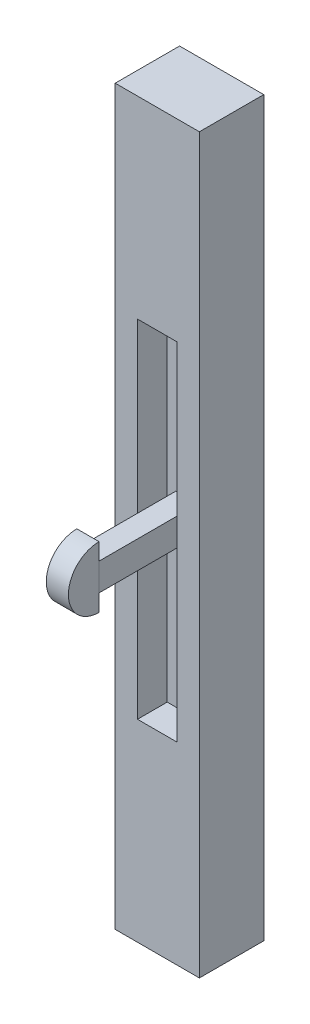
ISO-10303-21;
HEADER;
FILE_DESCRIPTION(('STEP AP214'),'2;1');
FILE_NAME('part.step','',(''),(''),'','','');
FILE_SCHEMA(('AUTOMOTIVE_DESIGN { 1 0 10303 214 1 1 1 1 }'));
ENDSEC;
DATA;
#1=APPLICATION_CONTEXT('core data for automotive mechanical design processes');
#2=APPLICATION_PROTOCOL_DEFINITION('international standard','automotive_design',2000,#1);
#3=PRODUCT_CONTEXT('',#1,'mechanical');
#4=PRODUCT('Part','Part','',(#3));
#5=PRODUCT_RELATED_PRODUCT_CATEGORY('part','',(#4));
#6=PRODUCT_DEFINITION_FORMATION('','',#4);
#7=PRODUCT_DEFINITION_CONTEXT('part definition',#1,'design');
#8=PRODUCT_DEFINITION('design','',#6,#7);
#9=PRODUCT_DEFINITION_SHAPE('','',#8);
#10=(LENGTH_UNIT() NAMED_UNIT(*) SI_UNIT(.MILLI.,.METRE.));
#11=(NAMED_UNIT(*) PLANE_ANGLE_UNIT() SI_UNIT($,.RADIAN.));
#12=(NAMED_UNIT(*) SI_UNIT($,.STERADIAN.) SOLID_ANGLE_UNIT());
#13=UNCERTAINTY_MEASURE_WITH_UNIT(LENGTH_MEASURE(1.E-05),#10,'distance_accuracy_value','');
#14=(GEOMETRIC_REPRESENTATION_CONTEXT(3) GLOBAL_UNCERTAINTY_ASSIGNED_CONTEXT((#13)) GLOBAL_UNIT_ASSIGNED_CONTEXT((#10,
#11,#12)) REPRESENTATION_CONTEXT('',''));
#15=CARTESIAN_POINT('',(0.,0.,0.));
#16=DIRECTION('',(0.,0.,1.));
#17=DIRECTION('',(1.,0.,0.));
#18=AXIS2_PLACEMENT_3D('',#15,#16,#17);
#19=CARTESIAN_POINT('',(0.,0.,3.5));
#20=DIRECTION('',(0.,0.,-1.));
#21=DIRECTION('',(-1.,0.,0.));
#22=AXIS2_PLACEMENT_3D('',#19,#20,#21);
#23=PLANE('',#22);
#24=DIRECTION('',(0.,1.,0.));
#25=VECTOR('',#24,1.);
#26=CARTESIAN_POINT('',(2.,-17.5,3.5));
#27=LINE('',#26,#25);
#28=CARTESIAN_POINT('',(2.,-17.5,3.5));
#29=VERTEX_POINT('',#28);
#30=CARTESIAN_POINT('',(2.,17.5,3.5));
#31=VERTEX_POINT('',#30);
#32=EDGE_CURVE('E394',#29,#31,#27,.T.);
#33=ORIENTED_EDGE('',*,*,#32,.T.);
#34=DIRECTION('',(-1.,0.,0.));
#35=VECTOR('',#34,1.);
#36=CARTESIAN_POINT('',(-2.,17.5,3.5));
#37=LINE('',#36,#35);
#38=CARTESIAN_POINT('',(-2.,17.5,3.5));
#39=VERTEX_POINT('',#38);
#40=EDGE_CURVE('E382',#31,#39,#37,.T.);
#41=ORIENTED_EDGE('',*,*,#40,.T.);
#42=DIRECTION('',(0.,-1.,0.));
#43=VECTOR('',#42,1.);
#44=CARTESIAN_POINT('',(-2.,-17.5,3.5));
#45=LINE('',#44,#43);
#46=CARTESIAN_POINT('',(-2.,-17.5,3.5));
#47=VERTEX_POINT('',#46);
#48=EDGE_CURVE('E378',#39,#47,#45,.T.);
#49=ORIENTED_EDGE('',*,*,#48,.T.);
#50=DIRECTION('',(1.,0.,0.));
#51=VECTOR('',#50,1.);
#52=CARTESIAN_POINT('',(-2.,-17.5,3.5));
#53=LINE('',#52,#51);
#54=EDGE_CURVE('E373',#47,#29,#53,.T.);
#55=ORIENTED_EDGE('',*,*,#54,.T.);
#56=EDGE_LOOP('',(#33,#41,#49,#55));
#57=FACE_BOUND('',#56,.T.);
#58=DIRECTION('',(0.,1.,0.));
#59=VECTOR('',#58,1.);
#60=CARTESIAN_POINT('',(1.12138831059993,-1.39122497803587,3.5));
#61=LINE('',#60,#59);
#62=CARTESIAN_POINT('',(1.12138831059993,-1.39122497803587,3.5));
#63=VERTEX_POINT('',#62);
#64=CARTESIAN_POINT('',(1.12138831059993,1.39122497803587,3.5));
#65=VERTEX_POINT('',#64);
#66=EDGE_CURVE('E158',#63,#65,#61,.T.);
#67=ORIENTED_EDGE('',*,*,#66,.F.);
#68=DIRECTION('',(1.,0.,0.));
#69=VECTOR('',#68,1.);
#70=CARTESIAN_POINT('',(-1.12138831059993,-1.39122497803587,3.5));
#71=LINE('',#70,#69);
#72=CARTESIAN_POINT('',(-1.12138831059993,-1.39122497803587,3.5));
#73=VERTEX_POINT('',#72);
#74=EDGE_CURVE('E152',#73,#63,#71,.T.);
#75=ORIENTED_EDGE('',*,*,#74,.F.);
#76=DIRECTION('',(0.,-1.,0.));
#77=VECTOR('',#76,1.);
#78=CARTESIAN_POINT('',(-1.12138831059993,-1.39122497803587,3.5));
#79=LINE('',#78,#77);
#80=CARTESIAN_POINT('',(-1.12138831059993,1.39122497803587,3.5));
#81=VERTEX_POINT('',#80);
#82=EDGE_CURVE('E156',#81,#73,#79,.T.);
#83=ORIENTED_EDGE('',*,*,#82,.F.);
#84=DIRECTION('',(-1.,0.,0.));
#85=VECTOR('',#84,1.);
#86=CARTESIAN_POINT('',(-1.12138831059993,1.39122497803587,3.5));
#87=LINE('',#86,#85);
#88=EDGE_CURVE('E58',#65,#81,#87,.T.);
#89=ORIENTED_EDGE('',*,*,#88,.F.);
#90=EDGE_LOOP('',(#67,#75,#83,#89));
#91=FACE_BOUND('',#90,.T.);
#92=ADVANCED_FACE('F41',(#57,#91),#23,.F.);
#93=CARTESIAN_POINT('',(4.25,37.,6.5));
#94=DIRECTION('',(0.,-1.,0.));
#95=DIRECTION('',(0.,0.,-1.));
#96=AXIS2_PLACEMENT_3D('',#93,#94,#95);
#97=PLANE('',#96);
#98=DIRECTION('',(-1.,0.,0.));
#99=VECTOR('',#98,1.);
#100=CARTESIAN_POINT('',(4.25,37.,0.));
#101=LINE('',#100,#99);
#102=CARTESIAN_POINT('',(4.25,37.,0.));
#103=VERTEX_POINT('',#102);
#104=CARTESIAN_POINT('',(-4.25,37.,0.));
#105=VERTEX_POINT('',#104);
#106=EDGE_CURVE('E332',#103,#105,#101,.T.);
#107=ORIENTED_EDGE('',*,*,#106,.T.);
#108=DIRECTION('',(0.,0.,-1.));
#109=VECTOR('',#108,1.);
#110=CARTESIAN_POINT('',(-4.25,37.,6.5));
#111=LINE('',#110,#109);
#112=CARTESIAN_POINT('',(-4.25,37.,6.5));
#113=VERTEX_POINT('',#112);
#114=EDGE_CURVE('E11',#113,#105,#111,.T.);
#115=ORIENTED_EDGE('',*,*,#114,.F.);
#116=DIRECTION('',(-1.,0.,0.));
#117=VECTOR('',#116,1.);
#118=CARTESIAN_POINT('',(4.25,37.,6.5));
#119=LINE('',#118,#117);
#120=CARTESIAN_POINT('',(4.25,37.,6.5));
#121=VERTEX_POINT('',#120);
#122=EDGE_CURVE('E343',#121,#113,#119,.T.);
#123=ORIENTED_EDGE('',*,*,#122,.F.);
#124=DIRECTION('',(0.,0.,-1.));
#125=VECTOR('',#124,1.);
#126=CARTESIAN_POINT('',(4.25,37.,6.5));
#127=LINE('',#126,#125);
#128=EDGE_CURVE('E342',#121,#103,#127,.T.);
#129=ORIENTED_EDGE('',*,*,#128,.T.);
#130=EDGE_LOOP('',(#107,#115,#123,#129));
#131=FACE_BOUND('',#130,.T.);
#132=ADVANCED_FACE('F43',(#131),#97,.F.);
#133=CARTESIAN_POINT('',(-4.25,-37.,6.5));
#134=DIRECTION('',(1.,0.,0.));
#135=DIRECTION('',(0.,0.,-1.));
#136=AXIS2_PLACEMENT_3D('',#133,#134,#135);
#137=PLANE('',#136);
#138=DIRECTION('',(0.,-1.,0.));
#139=VECTOR('',#138,1.);
#140=CARTESIAN_POINT('',(-4.25,-37.,0.));
#141=LINE('',#140,#139);
#142=CARTESIAN_POINT('',(-4.25,-37.,0.));
#143=VERTEX_POINT('',#142);
#144=EDGE_CURVE('E323',#105,#143,#141,.T.);
#145=ORIENTED_EDGE('',*,*,#144,.T.);
#146=DIRECTION('',(0.,0.,-1.));
#147=VECTOR('',#146,1.);
#148=CARTESIAN_POINT('',(-4.25,-37.,6.5));
#149=LINE('',#148,#147);
#150=CARTESIAN_POINT('',(-4.25,-37.,6.5));
#151=VERTEX_POINT('',#150);
#152=EDGE_CURVE('E51',#151,#143,#149,.T.);
#153=ORIENTED_EDGE('',*,*,#152,.F.);
#154=DIRECTION('',(0.,-1.,0.));
#155=VECTOR('',#154,1.);
#156=CARTESIAN_POINT('',(-4.25,-37.,6.5));
#157=LINE('',#156,#155);
#158=EDGE_CURVE('E355',#113,#151,#157,.T.);
#159=ORIENTED_EDGE('',*,*,#158,.F.);
#160=ORIENTED_EDGE('',*,*,#114,.T.);
#161=EDGE_LOOP('',(#145,#153,#159,#160));
#162=FACE_BOUND('',#161,.T.);
#163=ADVANCED_FACE('F314',(#162),#137,.F.);
#164=CARTESIAN_POINT('',(4.25,-37.,6.5));
#165=DIRECTION('',(0.,1.,0.));
#166=DIRECTION('',(0.,0.,1.));
#167=AXIS2_PLACEMENT_3D('',#164,#165,#166);
#168=PLANE('',#167);
#169=DIRECTION('',(1.,0.,0.));
#170=VECTOR('',#169,1.);
#171=CARTESIAN_POINT('',(4.25,-37.,0.));
#172=LINE('',#171,#170);
#173=CARTESIAN_POINT('',(4.25,-37.,0.));
#174=VERTEX_POINT('',#173);
#175=EDGE_CURVE('E329',#143,#174,#172,.T.);
#176=ORIENTED_EDGE('',*,*,#175,.T.);
#177=DIRECTION('',(0.,0.,-1.));
#178=VECTOR('',#177,1.);
#179=CARTESIAN_POINT('',(4.25,-37.,6.5));
#180=LINE('',#179,#178);
#181=CARTESIAN_POINT('',(4.25,-37.,6.5));
#182=VERTEX_POINT('',#181);
#183=EDGE_CURVE('E336',#182,#174,#180,.T.);
#184=ORIENTED_EDGE('',*,*,#183,.F.);
#185=DIRECTION('',(1.,0.,0.));
#186=VECTOR('',#185,1.);
#187=CARTESIAN_POINT('',(4.25,-37.,6.5));
#188=LINE('',#187,#186);
#189=EDGE_CURVE('E333',#151,#182,#188,.T.);
#190=ORIENTED_EDGE('',*,*,#189,.F.);
#191=ORIENTED_EDGE('',*,*,#152,.T.);
#192=EDGE_LOOP('',(#176,#184,#190,#191));
#193=FACE_BOUND('',#192,.T.);
#194=ADVANCED_FACE('F313',(#193),#168,.F.);
#195=CARTESIAN_POINT('',(4.25,-37.,6.5));
#196=DIRECTION('',(-1.,0.,0.));
#197=DIRECTION('',(0.,0.,1.));
#198=AXIS2_PLACEMENT_3D('',#195,#196,#197);
#199=PLANE('',#198);
#200=DIRECTION('',(0.,1.,0.));
#201=VECTOR('',#200,1.);
#202=CARTESIAN_POINT('',(4.25,-37.,0.));
#203=LINE('',#202,#201);
#204=EDGE_CURVE('E338',#174,#103,#203,.T.);
#205=ORIENTED_EDGE('',*,*,#204,.T.);
#206=ORIENTED_EDGE('',*,*,#128,.F.);
#207=DIRECTION('',(0.,1.,0.));
#208=VECTOR('',#207,1.);
#209=CARTESIAN_POINT('',(4.25,-37.,6.5));
#210=LINE('',#209,#208);
#211=EDGE_CURVE('E346',#182,#121,#210,.T.);
#212=ORIENTED_EDGE('',*,*,#211,.F.);
#213=ORIENTED_EDGE('',*,*,#183,.T.);
#214=EDGE_LOOP('',(#205,#206,#212,#213));
#215=FACE_BOUND('',#214,.T.);
#216=ADVANCED_FACE('F304',(#215),#199,.F.);
#217=CARTESIAN_POINT('',(0.,0.,6.5));
#218=DIRECTION('',(0.,0.,-1.));
#219=DIRECTION('',(-1.,0.,0.));
#220=AXIS2_PLACEMENT_3D('',#217,#218,#219);
#221=PLANE('',#220);
#222=DIRECTION('',(-1.,0.,0.));
#223=VECTOR('',#222,1.);
#224=CARTESIAN_POINT('',(-2.,17.5,6.5));
#225=LINE('',#224,#223);
#226=CARTESIAN_POINT('',(2.,17.5,6.5));
#227=VERTEX_POINT('',#226);
#228=CARTESIAN_POINT('',(-2.,17.5,6.5));
#229=VERTEX_POINT('',#228);
#230=EDGE_CURVE('E389',#227,#229,#225,.T.);
#231=ORIENTED_EDGE('',*,*,#230,.F.);
#232=DIRECTION('',(0.,1.,0.));
#233=VECTOR('',#232,1.);
#234=CARTESIAN_POINT('',(2.,-17.5,6.5));
#235=LINE('',#234,#233);
#236=CARTESIAN_POINT('',(2.,-17.5,6.5));
#237=VERTEX_POINT('',#236);
#238=EDGE_CURVE('E256',#237,#227,#235,.T.);
#239=ORIENTED_EDGE('',*,*,#238,.F.);
#240=DIRECTION('',(1.,0.,0.));
#241=VECTOR('',#240,1.);
#242=CARTESIAN_POINT('',(-2.,-17.5,6.5));
#243=LINE('',#242,#241);
#244=CARTESIAN_POINT('',(-2.,-17.5,6.5));
#245=VERTEX_POINT('',#244);
#246=EDGE_CURVE('E368',#245,#237,#243,.T.);
#247=ORIENTED_EDGE('',*,*,#246,.F.);
#248=DIRECTION('',(0.,-1.,0.));
#249=VECTOR('',#248,1.);
#250=CARTESIAN_POINT('',(-2.,-17.5,6.5));
#251=LINE('',#250,#249);
#252=EDGE_CURVE('E386',#229,#245,#251,.T.);
#253=ORIENTED_EDGE('',*,*,#252,.F.);
#254=EDGE_LOOP('',(#231,#239,#247,#253));
#255=FACE_BOUND('',#254,.T.);
#256=ORIENTED_EDGE('',*,*,#122,.T.);
#257=ORIENTED_EDGE('',*,*,#158,.T.);
#258=ORIENTED_EDGE('',*,*,#189,.T.);
#259=ORIENTED_EDGE('',*,*,#211,.T.);
#260=EDGE_LOOP('',(#256,#257,#258,#259));
#261=FACE_BOUND('',#260,.T.);
#262=ADVANCED_FACE('F303',(#255,#261),#221,.F.);
#263=CARTESIAN_POINT('',(0.,0.,0.));
#264=DIRECTION('',(0.,0.,-1.));
#265=DIRECTION('',(-1.,0.,0.));
#266=AXIS2_PLACEMENT_3D('',#263,#264,#265);
#267=PLANE('',#266);
#268=ORIENTED_EDGE('',*,*,#106,.F.);
#269=ORIENTED_EDGE('',*,*,#204,.F.);
#270=ORIENTED_EDGE('',*,*,#175,.F.);
#271=ORIENTED_EDGE('',*,*,#144,.F.);
#272=EDGE_LOOP('',(#268,#269,#270,#271));
#273=FACE_BOUND('',#272,.T.);
#274=ADVANCED_FACE('F298',(#273),#267,.T.);
#275=CARTESIAN_POINT('',(2.,-17.5,3.5));
#276=DIRECTION('',(1.,0.,0.));
#277=DIRECTION('',(0.,0.,-1.));
#278=AXIS2_PLACEMENT_3D('',#275,#276,#277);
#279=PLANE('',#278);
#280=ORIENTED_EDGE('',*,*,#238,.T.);
#281=DIRECTION('',(0.,0.,1.));
#282=VECTOR('',#281,1.);
#283=CARTESIAN_POINT('',(2.,17.5,3.5));
#284=LINE('',#283,#282);
#285=EDGE_CURVE('E367',#31,#227,#284,.T.);
#286=ORIENTED_EDGE('',*,*,#285,.F.);
#287=ORIENTED_EDGE('',*,*,#32,.F.);
#288=DIRECTION('',(0.,0.,1.));
#289=VECTOR('',#288,1.);
#290=CARTESIAN_POINT('',(2.,-17.5,3.5));
#291=LINE('',#290,#289);
#292=EDGE_CURVE('E356',#29,#237,#291,.T.);
#293=ORIENTED_EDGE('',*,*,#292,.T.);
#294=EDGE_LOOP('',(#280,#286,#287,#293));
#295=FACE_BOUND('',#294,.T.);
#296=ADVANCED_FACE('F289',(#295),#279,.F.);
#297=CARTESIAN_POINT('',(-2.,-17.5,3.5));
#298=DIRECTION('',(0.,-1.,0.));
#299=DIRECTION('',(0.,0.,-1.));
#300=AXIS2_PLACEMENT_3D('',#297,#298,#299);
#301=PLANE('',#300);
#302=ORIENTED_EDGE('',*,*,#246,.T.);
#303=ORIENTED_EDGE('',*,*,#292,.F.);
#304=ORIENTED_EDGE('',*,*,#54,.F.);
#305=DIRECTION('',(0.,0.,1.));
#306=VECTOR('',#305,1.);
#307=CARTESIAN_POINT('',(-2.,-17.5,3.5));
#308=LINE('',#307,#306);
#309=EDGE_CURVE('E359',#47,#245,#308,.T.);
#310=ORIENTED_EDGE('',*,*,#309,.T.);
#311=EDGE_LOOP('',(#302,#303,#304,#310));
#312=FACE_BOUND('',#311,.T.);
#313=ADVANCED_FACE('F285',(#312),#301,.F.);
#314=CARTESIAN_POINT('',(-2.,-17.5,3.5));
#315=DIRECTION('',(-1.,0.,0.));
#316=DIRECTION('',(0.,0.,1.));
#317=AXIS2_PLACEMENT_3D('',#314,#315,#316);
#318=PLANE('',#317);
#319=ORIENTED_EDGE('',*,*,#252,.T.);
#320=ORIENTED_EDGE('',*,*,#309,.F.);
#321=ORIENTED_EDGE('',*,*,#48,.F.);
#322=DIRECTION('',(0.,0.,1.));
#323=VECTOR('',#322,1.);
#324=CARTESIAN_POINT('',(-2.,17.5,3.5));
#325=LINE('',#324,#323);
#326=EDGE_CURVE('E361',#39,#229,#325,.T.);
#327=ORIENTED_EDGE('',*,*,#326,.T.);
#328=EDGE_LOOP('',(#319,#320,#321,#327));
#329=FACE_BOUND('',#328,.T.);
#330=ADVANCED_FACE('F286',(#329),#318,.F.);
#331=CARTESIAN_POINT('',(-2.,17.5,3.5));
#332=DIRECTION('',(0.,1.,0.));
#333=DIRECTION('',(0.,0.,1.));
#334=AXIS2_PLACEMENT_3D('',#331,#332,#333);
#335=PLANE('',#334);
#336=ORIENTED_EDGE('',*,*,#230,.T.);
#337=ORIENTED_EDGE('',*,*,#326,.F.);
#338=ORIENTED_EDGE('',*,*,#40,.F.);
#339=ORIENTED_EDGE('',*,*,#285,.T.);
#340=EDGE_LOOP('',(#336,#337,#338,#339));
#341=FACE_BOUND('',#340,.T.);
#342=ADVANCED_FACE('F278',(#341),#335,.F.);
#343=CARTESIAN_POINT('',(1.12138831059993,-1.39122497803587,13.5));
#344=DIRECTION('',(-1.,0.,0.));
#345=DIRECTION('',(0.,0.,1.));
#346=AXIS2_PLACEMENT_3D('',#343,#344,#345);
#347=PLANE('',#346);
#348=ORIENTED_EDGE('',*,*,#66,.T.);
#349=DIRECTION('',(0.,0.,-1.));
#350=VECTOR('',#349,1.);
#351=CARTESIAN_POINT('',(1.12138831059993,1.39122497803587,13.5));
#352=LINE('',#351,#350);
#353=CARTESIAN_POINT('',(1.12069415529996,1.39122497803587,13.5));
#354=VERTEX_POINT('',#353);
#355=EDGE_CURVE('E180',#354,#65,#352,.T.);
#356=ORIENTED_EDGE('',*,*,#355,.F.);
#357=CARTESIAN_POINT('',(1.12,-1.39122497803587,13.5));
#358=DIRECTION('',(0.,1.,0.));
#359=VECTOR('',#358,1.);
#360=LINE('',#357,#359);
#361=CARTESIAN_POINT('',(1.12069415529996,-1.39122497803587,13.5));
#362=VERTEX_POINT('',#361);
#363=EDGE_CURVE('E162',#362,#354,#360,.T.);
#364=ORIENTED_EDGE('',*,*,#363,.F.);
#365=DIRECTION('',(0.,0.,-1.));
#366=VECTOR('',#365,1.);
#367=CARTESIAN_POINT('',(1.12138831059993,-1.39122497803587,13.5));
#368=LINE('',#367,#366);
#369=EDGE_CURVE('E175',#362,#63,#368,.T.);
#370=ORIENTED_EDGE('',*,*,#369,.T.);
#371=EDGE_LOOP('',(#348,#356,#364,#370));
#372=FACE_BOUND('',#371,.T.);
#373=ADVANCED_FACE('F271',(#372),#347,.F.);
#374=CARTESIAN_POINT('',(-1.12138831059993,1.39122497803587,13.5));
#375=DIRECTION('',(0.,-1.,0.));
#376=DIRECTION('',(0.,0.,-1.));
#377=AXIS2_PLACEMENT_3D('',#374,#375,#376);
#378=PLANE('',#377);
#379=ORIENTED_EDGE('',*,*,#88,.T.);
#380=DIRECTION('',(0.,0.,-1.));
#381=VECTOR('',#380,1.);
#382=CARTESIAN_POINT('',(-1.12138831059993,1.39122497803587,13.5));
#383=LINE('',#382,#381);
#384=CARTESIAN_POINT('',(-1.12069415529996,1.39122497803587,13.5));
#385=VERTEX_POINT('',#384);
#386=EDGE_CURVE('E171',#385,#81,#383,.T.);
#387=ORIENTED_EDGE('',*,*,#386,.F.);
#388=DIRECTION('',(-1.,0.,0.));
#389=VECTOR('',#388,1.);
#390=CARTESIAN_POINT('',(-1.12138831059993,1.39122497803587,13.5));
#391=LINE('',#390,#389);
#392=EDGE_CURVE('E95',#354,#385,#391,.T.);
#393=ORIENTED_EDGE('',*,*,#392,.F.);
#394=ORIENTED_EDGE('',*,*,#355,.T.);
#395=EDGE_LOOP('',(#379,#387,#393,#394));
#396=FACE_BOUND('',#395,.T.);
#397=ADVANCED_FACE('F232',(#396),#378,.F.);
#398=CARTESIAN_POINT('',(-1.12138831059993,-1.39122497803587,13.5));
#399=DIRECTION('',(1.,0.,0.));
#400=DIRECTION('',(0.,0.,-1.));
#401=AXIS2_PLACEMENT_3D('',#398,#399,#400);
#402=PLANE('',#401);
#403=ORIENTED_EDGE('',*,*,#82,.T.);
#404=DIRECTION('',(0.,0.,-1.));
#405=VECTOR('',#404,1.);
#406=CARTESIAN_POINT('',(-1.12138831059993,-1.39122497803587,13.5));
#407=LINE('',#406,#405);
#408=CARTESIAN_POINT('',(-1.12069415529996,-1.39122497803587,13.5));
#409=VERTEX_POINT('',#408);
#410=EDGE_CURVE('E169',#409,#73,#407,.T.);
#411=ORIENTED_EDGE('',*,*,#410,.F.);
#412=CARTESIAN_POINT('',(-1.12,1.39122497803587,13.5));
#413=DIRECTION('',(0.,-1.,0.));
#414=VECTOR('',#413,1.);
#415=LINE('',#412,#414);
#416=EDGE_CURVE('E202',#385,#409,#415,.T.);
#417=ORIENTED_EDGE('',*,*,#416,.F.);
#418=ORIENTED_EDGE('',*,*,#386,.T.);
#419=EDGE_LOOP('',(#403,#411,#417,#418));
#420=FACE_BOUND('',#419,.T.);
#421=ADVANCED_FACE('F170',(#420),#402,.F.);
#422=CARTESIAN_POINT('',(-1.12138831059993,-1.39122497803587,13.5));
#423=DIRECTION('',(0.,1.,0.));
#424=DIRECTION('',(0.,0.,1.));
#425=AXIS2_PLACEMENT_3D('',#422,#423,#424);
#426=PLANE('',#425);
#427=ORIENTED_EDGE('',*,*,#74,.T.);
#428=ORIENTED_EDGE('',*,*,#369,.F.);
#429=DIRECTION('',(1.,0.,0.));
#430=VECTOR('',#429,1.);
#431=CARTESIAN_POINT('',(-1.12138831059993,-1.39122497803587,13.5));
#432=LINE('',#431,#430);
#433=EDGE_CURVE('E173',#409,#362,#432,.T.);
#434=ORIENTED_EDGE('',*,*,#433,.F.);
#435=ORIENTED_EDGE('',*,*,#410,.T.);
#436=EDGE_LOOP('',(#427,#428,#434,#435));
#437=FACE_BOUND('',#436,.T.);
#438=ADVANCED_FACE('F174',(#437),#426,.F.);
#439=CARTESIAN_POINT('',(1.12,-3.09309571256775,13.5));
#440=DIRECTION('',(0.,0.,1.));
#441=DIRECTION('',(1.,0.,0.));
#442=AXIS2_PLACEMENT_3D('',#439,#440,#441);
#443=PLANE('',#442);
#444=DIRECTION('',(0.,1.,0.));
#445=VECTOR('',#444,1.);
#446=CARTESIAN_POINT('',(1.12,0.,13.5));
#447=LINE('',#446,#445);
#448=CARTESIAN_POINT('',(1.12,3.09309571256775,13.5));
#449=VERTEX_POINT('',#448);
#450=EDGE_CURVE('E249',#354,#449,#447,.T.);
#451=ORIENTED_EDGE('',*,*,#450,.F.);
#452=ORIENTED_EDGE('',*,*,#392,.T.);
#453=DIRECTION('',(0.,1.,0.));
#454=VECTOR('',#453,1.);
#455=CARTESIAN_POINT('',(-1.12,0.,13.5));
#456=LINE('',#455,#454);
#457=CARTESIAN_POINT('',(-1.12,3.09309571256775,13.5));
#458=VERTEX_POINT('',#457);
#459=EDGE_CURVE('E189',#458,#385,#456,.F.);
#460=ORIENTED_EDGE('',*,*,#459,.F.);
#461=DIRECTION('',(-1.,0.,0.));
#462=VECTOR('',#461,1.);
#463=CARTESIAN_POINT('',(1.12,3.09309571256775,13.5));
#464=LINE('',#463,#462);
#465=EDGE_CURVE('E78',#449,#458,#464,.T.);
#466=ORIENTED_EDGE('',*,*,#465,.F.);
#467=EDGE_LOOP('',(#451,#452,#460,#466));
#468=FACE_BOUND('',#467,.T.);
#469=ADVANCED_FACE('F221',(#468),#443,.F.);
#470=DIRECTION('',(-1.,0.,0.));
#471=VECTOR('',#470,1.);
#472=CARTESIAN_POINT('',(1.12,-3.09309571256775,13.5));
#473=LINE('',#472,#471);
#474=CARTESIAN_POINT('',(1.12,-3.09309571256775,13.5));
#475=VERTEX_POINT('',#474);
#476=CARTESIAN_POINT('',(-1.12,-3.09309571256775,13.5));
#477=VERTEX_POINT('',#476);
#478=EDGE_CURVE('E82',#475,#477,#473,.T.);
#479=ORIENTED_EDGE('',*,*,#478,.T.);
#480=DIRECTION('',(0.,1.,0.));
#481=VECTOR('',#480,1.);
#482=CARTESIAN_POINT('',(-1.12,0.,13.5));
#483=LINE('',#482,#481);
#484=EDGE_CURVE('E195',#409,#477,#483,.F.);
#485=ORIENTED_EDGE('',*,*,#484,.F.);
#486=ORIENTED_EDGE('',*,*,#433,.T.);
#487=DIRECTION('',(0.,1.,0.));
#488=VECTOR('',#487,1.);
#489=CARTESIAN_POINT('',(1.12,0.,13.5));
#490=LINE('',#489,#488);
#491=EDGE_CURVE('E186',#475,#362,#490,.T.);
#492=ORIENTED_EDGE('',*,*,#491,.F.);
#493=EDGE_LOOP('',(#479,#485,#486,#492));
#494=FACE_BOUND('',#493,.T.);
#495=ADVANCED_FACE('F227',(#494),#443,.F.);
#496=CARTESIAN_POINT('',(1.12,0.,13.5));
#497=DIRECTION('',(-1.,0.,0.));
#498=DIRECTION('',(0.,0.,1.));
#499=AXIS2_PLACEMENT_3D('',#496,#497,#498);
#500=CYLINDRICAL_SURFACE('',#499,3.09309571256775);
#501=ORIENTED_EDGE('',*,*,#465,.T.);
#502=CARTESIAN_POINT('',(-1.12,0.,13.5));
#503=DIRECTION('',(-1.,0.,0.));
#504=DIRECTION('',(0.,0.,-1.));
#505=AXIS2_PLACEMENT_3D('',#502,#503,#504);
#506=CIRCLE('',#505,3.09309571256775);
#507=EDGE_CURVE('E194',#477,#458,#506,.T.);
#508=ORIENTED_EDGE('',*,*,#507,.F.);
#509=ORIENTED_EDGE('',*,*,#478,.F.);
#510=CARTESIAN_POINT('',(1.12,0.,13.5));
#511=DIRECTION('',(-1.,0.,0.));
#512=DIRECTION('',(0.,0.,1.));
#513=AXIS2_PLACEMENT_3D('',#510,#511,#512);
#514=CIRCLE('',#513,3.09309571256775);
#515=EDGE_CURVE('E193',#475,#449,#514,.T.);
#516=ORIENTED_EDGE('',*,*,#515,.T.);
#517=EDGE_LOOP('',(#501,#508,#509,#516));
#518=FACE_BOUND('',#517,.T.);
#519=ADVANCED_FACE('F222',(#518),#500,.T.);
#520=CARTESIAN_POINT('',(1.12,0.,13.5));
#521=DIRECTION('',(-1.,0.,0.));
#522=DIRECTION('',(0.,0.,1.));
#523=AXIS2_PLACEMENT_3D('',#520,#521,#522);
#524=PLANE('',#523);
#525=ORIENTED_EDGE('',*,*,#515,.F.);
#526=ORIENTED_EDGE('',*,*,#491,.T.);
#527=ORIENTED_EDGE('',*,*,#363,.T.);
#528=ORIENTED_EDGE('',*,*,#450,.T.);
#529=EDGE_LOOP('',(#525,#526,#527,#528));
#530=FACE_BOUND('',#529,.T.);
#531=ADVANCED_FACE('F211',(#530),#524,.F.);
#532=CARTESIAN_POINT('',(-1.12,0.,13.5));
#533=DIRECTION('',(1.,0.,0.));
#534=DIRECTION('',(0.,0.,-1.));
#535=AXIS2_PLACEMENT_3D('',#532,#533,#534);
#536=PLANE('',#535);
#537=ORIENTED_EDGE('',*,*,#507,.T.);
#538=ORIENTED_EDGE('',*,*,#459,.T.);
#539=ORIENTED_EDGE('',*,*,#416,.T.);
#540=ORIENTED_EDGE('',*,*,#484,.T.);
#541=EDGE_LOOP('',(#537,#538,#539,#540));
#542=FACE_BOUND('',#541,.T.);
#543=ADVANCED_FACE('F219',(#542),#536,.F.);
#544=CLOSED_SHELL('',(#92,#132,#163,#194,#216,#262,#274,#296,#313,#330,#342,#373,#397,#421,#438,
#469,#495,#519,#531,#543));
#545=MANIFOLD_SOLID_BREP('B2',#544);
#546=ADVANCED_BREP_SHAPE_REPRESENTATION('',(#18,#545),#14);
#547=SHAPE_DEFINITION_REPRESENTATION(#9,#546);
ENDSEC;
END-ISO-10303-21;
